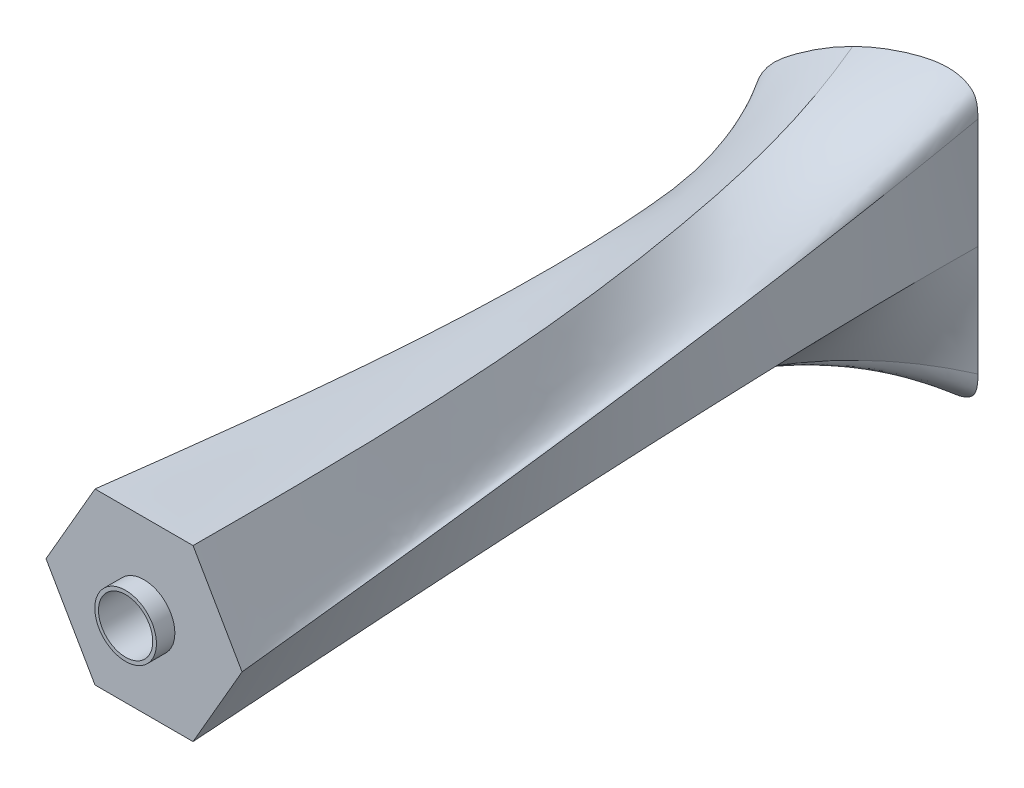
ISO-10303-21;
HEADER;
FILE_DESCRIPTION(('STEP AP214'),'2;1');
FILE_NAME('part.step','',(''),(''),'','','');
FILE_SCHEMA(('AUTOMOTIVE_DESIGN { 1 0 10303 214 1 1 1 1 }'));
ENDSEC;
DATA;
#1=APPLICATION_CONTEXT('core data for automotive mechanical design processes');
#2=APPLICATION_PROTOCOL_DEFINITION('international standard','automotive_design',2000,#1);
#3=PRODUCT_CONTEXT('',#1,'mechanical');
#4=PRODUCT('Part','Part','',(#3));
#5=PRODUCT_RELATED_PRODUCT_CATEGORY('part','',(#4));
#6=PRODUCT_DEFINITION_FORMATION('','',#4);
#7=PRODUCT_DEFINITION_CONTEXT('part definition',#1,'design');
#8=PRODUCT_DEFINITION('design','',#6,#7);
#9=PRODUCT_DEFINITION_SHAPE('','',#8);
#10=(LENGTH_UNIT() NAMED_UNIT(*) SI_UNIT(.MILLI.,.METRE.));
#11=(NAMED_UNIT(*) PLANE_ANGLE_UNIT() SI_UNIT($,.RADIAN.));
#12=(NAMED_UNIT(*) SI_UNIT($,.STERADIAN.) SOLID_ANGLE_UNIT());
#13=UNCERTAINTY_MEASURE_WITH_UNIT(LENGTH_MEASURE(1.E-05),#10,'distance_accuracy_value','');
#14=(GEOMETRIC_REPRESENTATION_CONTEXT(3) GLOBAL_UNCERTAINTY_ASSIGNED_CONTEXT((#13)) GLOBAL_UNIT_ASSIGNED_CONTEXT((#10,
#11,#12)) REPRESENTATION_CONTEXT('',''));
#15=CARTESIAN_POINT('',(0.,0.,0.));
#16=DIRECTION('',(0.,0.,1.));
#17=DIRECTION('',(1.,0.,0.));
#18=AXIS2_PLACEMENT_3D('',#15,#16,#17);
#19=CARTESIAN_POINT('',(0.,0.,400.));
#20=DIRECTION('',(0.,0.,1.));
#21=DIRECTION('',(1.,0.,0.));
#22=AXIS2_PLACEMENT_3D('',#19,#20,#21);
#23=PLANE('',#22);
#24=CARTESIAN_POINT('',(0.,0.,400.));
#25=DIRECTION('',(0.,0.,1.));
#26=DIRECTION('',(1.,0.,0.));
#27=AXIS2_PLACEMENT_3D('',#24,#25,#26);
#28=CIRCLE('',#27,16.7417135288678);
#29=CARTESIAN_POINT('',(16.7417135288678,0.,400.));
#30=VERTEX_POINT('',#29);
#31=EDGE_CURVE('E12',#30,#30,#28,.T.);
#32=ORIENTED_EDGE('',*,*,#31,.F.);
#33=EDGE_LOOP('',(#32));
#34=FACE_BOUND('',#33,.T.);
#35=DIRECTION('',(-0.5,-0.866025403784439,0.));
#36=VECTOR('',#35,1.);
#37=CARTESIAN_POINT('',(-26.6239504938894,46.1140349536149,400.));
#38=LINE('',#37,#36);
#39=CARTESIAN_POINT('',(-26.6239504938894,46.1140349536149,400.));
#40=VERTEX_POINT('',#39);
#41=CARTESIAN_POINT('',(-53.2479009877787,0.,400.));
#42=VERTEX_POINT('',#41);
#43=EDGE_CURVE('E300',#40,#42,#38,.T.);
#44=ORIENTED_EDGE('',*,*,#43,.T.);
#45=DIRECTION('',(0.5,-0.866025403784438,0.));
#46=VECTOR('',#45,1.);
#47=CARTESIAN_POINT('',(-53.2479009877787,0.,400.));
#48=LINE('',#47,#46);
#49=CARTESIAN_POINT('',(-26.6239504938894,-46.1140349536149,400.));
#50=VERTEX_POINT('',#49);
#51=EDGE_CURVE('E355',#42,#50,#48,.T.);
#52=ORIENTED_EDGE('',*,*,#51,.T.);
#53=DIRECTION('',(1.,0.,0.));
#54=VECTOR('',#53,1.);
#55=CARTESIAN_POINT('',(-26.6239504938894,-46.1140349536149,400.));
#56=LINE('',#55,#54);
#57=CARTESIAN_POINT('',(26.6239504938894,-46.1140349536149,400.));
#58=VERTEX_POINT('',#57);
#59=EDGE_CURVE('E441',#50,#58,#56,.T.);
#60=ORIENTED_EDGE('',*,*,#59,.T.);
#61=DIRECTION('',(0.5,0.866025403784439,0.));
#62=VECTOR('',#61,1.);
#63=CARTESIAN_POINT('',(26.6239504938894,-46.1140349536149,400.));
#64=LINE('',#63,#62);
#65=CARTESIAN_POINT('',(53.2479009877787,0.,400.));
#66=VERTEX_POINT('',#65);
#67=EDGE_CURVE('E409',#58,#66,#64,.T.);
#68=ORIENTED_EDGE('',*,*,#67,.T.);
#69=DIRECTION('',(-0.5,0.866025403784439,0.));
#70=VECTOR('',#69,1.);
#71=CARTESIAN_POINT('',(53.2479009877787,0.,400.));
#72=LINE('',#71,#70);
#73=CARTESIAN_POINT('',(26.6239504938894,46.1140349536149,400.));
#74=VERTEX_POINT('',#73);
#75=EDGE_CURVE('E404',#66,#74,#72,.T.);
#76=ORIENTED_EDGE('',*,*,#75,.T.);
#77=DIRECTION('',(-1.,0.,0.));
#78=VECTOR('',#77,1.);
#79=CARTESIAN_POINT('',(26.6239504938894,46.1140349536149,400.));
#80=LINE('',#79,#78);
#81=EDGE_CURVE('E224',#74,#40,#80,.T.);
#82=ORIENTED_EDGE('',*,*,#81,.T.);
#83=EDGE_LOOP('',(#44,#52,#60,#68,#76,#82));
#84=FACE_BOUND('',#83,.T.);
#85=ADVANCED_FACE('F214',(#34,#84),#23,.T.);
#86=CARTESIAN_POINT('',(-15.0373642119858,60.0919893012358,0.));
#87=DIRECTION('',(0.,0.,-1.));
#88=DIRECTION('',(-1.,0.,0.));
#89=AXIS2_PLACEMENT_3D('',#86,#87,#88);
#90=PLANE('',#89);
#91=CARTESIAN_POINT('',(0.,0.,0.));
#92=DIRECTION('',(0.,0.,-1.));
#93=DIRECTION('',(-1.,0.,0.));
#94=AXIS2_PLACEMENT_3D('',#91,#92,#93);
#95=CIRCLE('',#94,14.7417135288678);
#96=CARTESIAN_POINT('',(-14.7417135288678,0.,0.));
#97=VERTEX_POINT('',#96);
#98=EDGE_CURVE('E640',#97,#97,#95,.F.);
#99=ORIENTED_EDGE('',*,*,#98,.T.);
#100=EDGE_LOOP('',(#99));
#101=FACE_BOUND('',#100,.T.);
#102=CARTESIAN_POINT('',(52.9999999999999,60.,0.));
#103=CARTESIAN_POINT('',(52.9999999999999,69.1159610700958,0.));
#104=CARTESIAN_POINT('',(44.4020992876868,78.7091502966451,0.));
#105=CARTESIAN_POINT('',(3.59329165933707,71.3680812588061,0.));
#106=CARTESIAN_POINT('',(-41.0599767034841,47.5530420157573,0.));
#107=CARTESIAN_POINT('',(-69.0000000000001,22.1315700799517,0.));
#108=CARTESIAN_POINT('',(-69.,5.07899308115912,0.));
#109=B_SPLINE_CURVE_WITH_KNOTS('',3,(#102,#103,#104,#105,#106,#107,#108),.UNSPECIFIED.,.F.,.F.,
(4,1,1,1,4),(0.,0.0739990040143119,0.286658719787785,0.740794666502256,1.),.UNSPECIFIED.);
#110=CARTESIAN_POINT('',(52.9999999999999,60.0000000000001,0.));
#111=VERTEX_POINT('',#110);
#112=CARTESIAN_POINT('',(-15.0373642122471,60.0919893011055,0.));
#113=VERTEX_POINT('',#112);
#114=EDGE_CURVE('E286',#111,#113,#109,.T.);
#115=ORIENTED_EDGE('',*,*,#114,.F.);
#116=DIRECTION('',(0.,1.,0.));
#117=VECTOR('',#116,1.);
#118=CARTESIAN_POINT('',(53.0000000000001,-60.,0.));
#119=LINE('',#118,#117);
#120=CARTESIAN_POINT('',(53.,0.,0.));
#121=VERTEX_POINT('',#120);
#122=EDGE_CURVE('E468',#121,#111,#119,.T.);
#123=ORIENTED_EDGE('',*,*,#122,.F.);
#124=CARTESIAN_POINT('',(53.0000000000001,-60.,0.));
#125=VERTEX_POINT('',#124);
#126=EDGE_CURVE('E465',#125,#121,#119,.T.);
#127=ORIENTED_EDGE('',*,*,#126,.F.);
#128=CARTESIAN_POINT('',(-69.,-5.07899308115939,0.));
#129=CARTESIAN_POINT('',(-69.,-22.131570079952,0.));
#130=CARTESIAN_POINT('',(-41.059976703484,-47.5530420157575,0.));
#131=CARTESIAN_POINT('',(3.59329165933726,-71.3680812588063,0.));
#132=CARTESIAN_POINT('',(44.402099287687,-78.709150296645,0.));
#133=CARTESIAN_POINT('',(53.0000000000001,-69.1159610700957,0.));
#134=CARTESIAN_POINT('',(53.0000000000001,-60.,0.));
#135=B_SPLINE_CURVE_WITH_KNOTS('',3,(#128,#129,#130,#131,#132,#133,#134),.UNSPECIFIED.,.F.,.F.,
(4,1,1,1,4),(0.,0.259205333497744,0.713341280212215,0.926000995985688,1.),.UNSPECIFIED.);
#136=CARTESIAN_POINT('',(-69.,-5.07899308115939,0.));
#137=VERTEX_POINT('',#136);
#138=EDGE_CURVE('E279',#137,#125,#135,.T.);
#139=ORIENTED_EDGE('',*,*,#138,.F.);
#140=DIRECTION('',(0.,-1.,0.));
#141=VECTOR('',#140,1.);
#142=CARTESIAN_POINT('',(-69.,5.07899308115912,0.));
#143=LINE('',#142,#141);
#144=CARTESIAN_POINT('',(-69.,5.07899308115912,0.));
#145=VERTEX_POINT('',#144);
#146=EDGE_CURVE('E271',#145,#137,#143,.T.);
#147=ORIENTED_EDGE('',*,*,#146,.F.);
#148=EDGE_CURVE('E276',#113,#145,#109,.T.);
#149=ORIENTED_EDGE('',*,*,#148,.F.);
#150=EDGE_LOOP('',(#115,#123,#127,#139,#147,#149));
#151=FACE_BOUND('',#150,.T.);
#152=ADVANCED_FACE('F275',(#101,#151),#90,.T.);
#153=CARTESIAN_POINT('',(53.0000000000001,-60.,0.));
#154=CARTESIAN_POINT('',(24.6310418483275,-47.8812141708108,30.3470000079347));
#155=CARTESIAN_POINT('',(-30.6471797643207,-28.8561105763167,161.254535663122));
#156=CARTESIAN_POINT('',(-28.4515918142654,-38.6239041398874,297.013666674601));
#157=CARTESIAN_POINT('',(-26.6239504938894,-46.1140349536149,400.));
#158=CARTESIAN_POINT('',(53.0000000000001,-40.,0.));
#159=CARTESIAN_POINT('',(30.7384725890359,-35.0874248680189,30.9250320509449));
#160=CARTESIAN_POINT('',(-12.3510202419729,-29.7908385638429,160.319677642095));
#161=CARTESIAN_POINT('',(-10.511294187384,-39.1634481704289,297.591698717612));
#162=CARTESIAN_POINT('',(-8.87465016462978,-46.1140349536149,400.));
#163=CARTESIAN_POINT('',(53.,-20.,0.));
#164=CARTESIAN_POINT('',(36.8459033297443,-22.293635565227,31.5030640939551));
#165=CARTESIAN_POINT('',(5.94513928037495,-30.7255665513692,159.384819621069));
#166=CARTESIAN_POINT('',(7.42900343949746,-39.7029922009703,298.169730760622));
#167=CARTESIAN_POINT('',(8.8746501646298,-46.1140349536149,400.));
#168=CARTESIAN_POINT('',(53.,0.,0.));
#169=CARTESIAN_POINT('',(42.9533340704527,-9.49984626243509,32.0810961369654));
#170=CARTESIAN_POINT('',(24.2412988027228,-31.6602945388954,158.449961600043));
#171=CARTESIAN_POINT('',(25.3693010663789,-40.2425362315117,298.747762803632));
#172=CARTESIAN_POINT('',(26.6239504938894,-46.1140349536149,400.));
#173=B_SPLINE_SURFACE_WITH_KNOTS('',3,3,((#153,#154,#155,#156,#157),(#158,#159,#160,#161,#162),
(#163,#164,#165,#166,#167),(#168,#169,#170,#171,#172)),.UNSPECIFIED.,.F.,.F.,.F.,(4,4),(4,1,4),
(0.,1.),(0.,0.257174354760938,1.),.UNSPECIFIED.);
#174=CARTESIAN_POINT('',(53.,0.,0.));
#175=CARTESIAN_POINT('',(42.9533340704527,-9.49984626243509,32.0810961369654));
#176=CARTESIAN_POINT('',(24.2412988027228,-31.6602945388954,158.449961600043));
#177=CARTESIAN_POINT('',(25.3693010663789,-40.2425362315117,298.747762803632));
#178=CARTESIAN_POINT('',(26.6239504938894,-46.1140349536149,400.));
#179=B_SPLINE_CURVE_WITH_KNOTS('',3,(#174,#175,#176,#177,#178),.UNSPECIFIED.,.F.,.F.,(4,1,4),
(0.,0.257174354760938,1.),.UNSPECIFIED.);
#180=EDGE_CURVE('E464',#121,#58,#179,.T.);
#181=CARTESIAN_POINT('',(53.0000000000001,-60.,0.));
#182=CARTESIAN_POINT('',(24.6310418483275,-47.8812141708108,30.3470000079347));
#183=CARTESIAN_POINT('',(-30.6471797643207,-28.8561105763167,161.254535663122));
#184=CARTESIAN_POINT('',(-28.4515918142654,-38.6239041398874,297.013666674601));
#185=CARTESIAN_POINT('',(-26.6239504938894,-46.1140349536149,400.));
#186=B_SPLINE_CURVE_WITH_KNOTS('',3,(#181,#182,#183,#184,#185),.UNSPECIFIED.,.F.,.F.,(4,1,4),
(0.,0.257174354760938,1.),.UNSPECIFIED.);
#187=EDGE_CURVE('E463',#50,#125,#186,.F.);
#188=ORIENTED_EDGE('',*,*,#126,.T.);
#189=ORIENTED_EDGE('',*,*,#180,.T.);
#190=ORIENTED_EDGE('',*,*,#59,.F.);
#191=ORIENTED_EDGE('',*,*,#187,.T.);
#192=EDGE_LOOP('',(#188,#189,#190,#191));
#193=FACE_BOUND('',#192,.T.);
#194=ADVANCED_FACE('F462',(#193),#173,.T.);
#195=CARTESIAN_POINT('',(53.,0.,0.));
#196=CARTESIAN_POINT('',(42.9533340704527,-9.49984626243509,32.0810961369654));
#197=CARTESIAN_POINT('',(24.2412988027227,-31.6602945388954,158.449961600043));
#198=CARTESIAN_POINT('',(25.3693010663789,-40.2425362315117,298.747762803632));
#199=CARTESIAN_POINT('',(26.6239504938894,-46.1140349536149,400.));
#200=CARTESIAN_POINT('',(53.,20.,0.));
#201=CARTESIAN_POINT('',(42.2154452997272,6.47288569592673,31.8651390261619));
#202=CARTESIAN_POINT('',(24.4105280379211,-22.0615279952037,158.799231575079));
#203=CARTESIAN_POINT('',(30.54784573874,-27.3555742834577,298.531805692829));
#204=CARTESIAN_POINT('',(35.4986006585192,-30.7426899690766,400.));
#205=CARTESIAN_POINT('',(53.,40.,0.));
#206=CARTESIAN_POINT('',(41.4775565290017,22.4456176542885,31.6491819153585));
#207=CARTESIAN_POINT('',(24.5797572731195,-12.4627614515119,159.148501550115));
#208=CARTESIAN_POINT('',(35.7263904111011,-14.4686123354037,298.315848582025));
#209=CARTESIAN_POINT('',(44.373250823149,-15.3713449845383,400.));
#210=CARTESIAN_POINT('',(52.9999999999999,60.0000000000001,0.));
#211=CARTESIAN_POINT('',(40.7396677582763,38.4183496126504,31.433224804555));
#212=CARTESIAN_POINT('',(24.7489865083178,-2.86399490782015,159.497771525151));
#213=CARTESIAN_POINT('',(40.9049350834622,-1.58165038734968,298.099891471222));
#214=CARTESIAN_POINT('',(53.2479009877787,0.,400.));
#215=B_SPLINE_SURFACE_WITH_KNOTS('',3,3,((#195,#196,#197,#198,#199),(#200,#201,#202,#203,#204),
(#205,#206,#207,#208,#209),(#210,#211,#212,#213,#214)),.UNSPECIFIED.,.F.,.F.,.F.,(4,4),(4,1,4),
(0.,1.),(0.,0.257174354760938,1.),.UNSPECIFIED.);
#216=CARTESIAN_POINT('',(52.9999999999999,60.0000000000001,0.));
#217=CARTESIAN_POINT('',(40.7396677582763,38.4183496126504,31.433224804555));
#218=CARTESIAN_POINT('',(24.7489865083178,-2.86399490782015,159.497771525151));
#219=CARTESIAN_POINT('',(40.9049350834622,-1.58165038734968,298.099891471222));
#220=CARTESIAN_POINT('',(53.2479009877787,0.,400.));
#221=B_SPLINE_CURVE_WITH_KNOTS('',3,(#216,#217,#218,#219,#220),.UNSPECIFIED.,.F.,.F.,(4,1,4),
(0.,0.257174354760938,1.),.UNSPECIFIED.);
#222=EDGE_CURVE('E305',#111,#66,#221,.T.);
#223=ORIENTED_EDGE('',*,*,#122,.T.);
#224=ORIENTED_EDGE('',*,*,#222,.T.);
#225=ORIENTED_EDGE('',*,*,#67,.F.);
#226=ORIENTED_EDGE('',*,*,#180,.F.);
#227=EDGE_LOOP('',(#223,#224,#225,#226));
#228=FACE_BOUND('',#227,.T.);
#229=ADVANCED_FACE('F373',(#228),#215,.T.);
#230=CARTESIAN_POINT('',(-69.,-5.07899308115939,0.));
#231=CARTESIAN_POINT('',(-47.393481818453,-15.4453230909937,32.3352916155948));
#232=CARTESIAN_POINT('',(-15.8341530514473,-27.9524668294481,158.038848263025));
#233=CARTESIAN_POINT('',(-36.8920824769722,-12.0593277035542,299.001958282261));
#234=CARTESIAN_POINT('',(-53.2479009877787,0.,400.));
#235=CARTESIAN_POINT('',(-69.,-9.19073741929746,0.));
#236=CARTESIAN_POINT('',(-47.1569608251326,-17.50670876261,32.3400691883035));
#237=CARTESIAN_POINT('',(-14.4114703968578,-26.0878832417253,158.031121438497));
#238=CARTESIAN_POINT('',(-36.1722074545428,-11.9326071892124,299.00673585497));
#239=CARTESIAN_POINT('',(-52.6932353524894,-0.960709061533651,400.));
#240=CARTESIAN_POINT('',(-67.8193825685981,-16.5055481878557,0.));
#241=CARTESIAN_POINT('',(-45.50330140709,-20.7208021981246,32.349624333721));
#242=CARTESIAN_POINT('',(-13.2711602166725,-23.6710344227163,158.015667789441));
#243=CARTESIAN_POINT('',(-34.7324574096839,-11.6791661605289,299.016291000388));
#244=CARTESIAN_POINT('',(-51.5839040819107,-2.88212718460094,400.));
#245=CARTESIAN_POINT('',(-63.2894695065897,-25.3301094077434,0.));
#246=CARTESIAN_POINT('',(-42.430432947814,-25.0750275477511,32.3785289760455));
#247=CARTESIAN_POINT('',(-12.2552083279209,-20.5952756422473,157.968919971481));
#248=CARTESIAN_POINT('',(-33.5029276578076,-12.019991981713,299.045195642712));
#249=CARTESIAN_POINT('',(-49.9199071760426,-5.76425436920188,400.));
#250=CARTESIAN_POINT('',(-57.8664570229374,-31.3765581710786,0.));
#251=CARTESIAN_POINT('',(-39.0579207086074,-28.0607121770605,32.4216046468823));
#252=CARTESIAN_POINT('',(-12.5187831168298,-18.911301908346,157.899253182451));
#253=CARTESIAN_POINT('',(-32.8375729776284,-12.5884062078644,299.088271313549));
#254=CARTESIAN_POINT('',(-48.5332430878192,-8.16602702303599,400.));
#255=CARTESIAN_POINT('',(-52.931395452378,-35.7194662795903,0.));
#256=CARTESIAN_POINT('',(-36.1393103485606,-30.2641640017131,32.4495466921982));
#257=CARTESIAN_POINT('',(-13.0201878677334,-17.8084594356236,157.854062183953));
#258=CARTESIAN_POINT('',(-32.4673165326842,-13.1758897210257,299.116213358865));
#259=CARTESIAN_POINT('',(-47.4239118172404,-10.0874451461033,400.));
#260=CARTESIAN_POINT('',(-49.0269984838212,-38.7995637827274,0.));
#261=CARTESIAN_POINT('',(-33.86276595671,-31.8407633455555,32.4630192660508));
#262=CARTESIAN_POINT('',(-13.5141066141855,-17.083519999444,157.832272831819));
#263=CARTESIAN_POINT('',(-32.2394664589599,-13.6601297002574,299.129685932718));
#264=CARTESIAN_POINT('',(-46.5919133643064,-11.5285087384037,400.));
#265=CARTESIAN_POINT('',(-45.0269314150286,-41.7831985102968,0.));
#266=CARTESIAN_POINT('',(-31.5476228862595,-33.3787764345176,32.464380260895));
#267=CARTESIAN_POINT('',(-14.0595048608204,-16.4099268224096,157.830071678852));
#268=CARTESIAN_POINT('',(-32.0362542819011,-14.1696736361481,299.131046927561));
#269=CARTESIAN_POINT('',(-45.7599149113723,-12.9695723307042,400.));
#270=CARTESIAN_POINT('',(-40.9593774061973,-44.6868534782732,0.));
#271=CARTESIAN_POINT('',(-29.2040750326816,-34.8843506410387,32.4525629164262));
#272=CARTESIAN_POINT('',(-14.6430290524314,-15.7795480756383,157.849184009038));
#273=CARTESIAN_POINT('',(-31.8497742265991,-14.7002106011731,299.119229583093));
#274=CARTESIAN_POINT('',(-44.9279164584383,-14.4106359230047,400.));
#275=CARTESIAN_POINT('',(-36.8160516195801,-47.5007710828428,0.));
#276=CARTESIAN_POINT('',(-26.8286820397434,-36.3537998743776,32.4277840874437));
#277=CARTESIAN_POINT('',(-15.2693191665575,-15.1972438442931,157.889259100559));
#278=CARTESIAN_POINT('',(-31.6819245959196,-15.2544175200732,299.09445075411));
#279=CARTESIAN_POINT('',(-44.0959180055043,-15.8516995153051,400.));
#280=CARTESIAN_POINT('',(-31.198627596288,-51.1300424861392,0.));
#281=CARTESIAN_POINT('',(-23.6218039784361,-38.2637483477609,32.3772460297177));
#282=CARTESIAN_POINT('',(-16.1578258583447,-14.486446981368,157.970994895665));
#283=CARTESIAN_POINT('',(-31.4804443872336,-16.0257992058588,299.043912696385));
#284=CARTESIAN_POINT('',(-42.9865867349255,-17.7731176383724,400.));
#285=CARTESIAN_POINT('',(-23.9968152786962,-55.427226276019,0.));
#286=CARTESIAN_POINT('',(-19.5356056610384,-40.5550755338951,32.2811749738894));
#287=CARTESIAN_POINT('',(-17.3731882420795,-13.7257605183685,158.126371744086));
#288=CARTESIAN_POINT('',(-31.2710102312231,-17.0535179482678,298.947841640556));
#289=CARTESIAN_POINT('',(-41.5999226467021,-20.1748902922065,400.));
#290=CARTESIAN_POINT('',(-16.5685989580877,-59.3763428880387,0.));
#291=CARTESIAN_POINT('',(-15.3490999498301,-42.7067293575584,32.1410886603588));
#292=CARTESIAN_POINT('',(-18.7246508110828,-13.1508009793675,158.352934986425));
#293=CARTESIAN_POINT('',(-31.1122063925092,-18.1736094288741,298.807755327025));
#294=CARTESIAN_POINT('',(-40.2132585584787,-22.5766629460406,400.));
#295=CARTESIAN_POINT('',(-10.4899935307653,-62.3127635204361,0.));
#296=CARTESIAN_POINT('',(-11.9380048977213,-44.3385209869329,32.0023849812586));
#297=CARTESIAN_POINT('',(-19.8902185034221,-12.8099133134083,158.577262077839));
#298=CARTESIAN_POINT('',(-31.0139607278217,-19.1287326798983,298.669051647926));
#299=CARTESIAN_POINT('',(-39.1039272879,-24.4980810691079,400.));
#300=CARTESIAN_POINT('',(-5.86624267025815,-64.3986278326721,0.));
#301=CARTESIAN_POINT('',(-9.34965398343143,-45.5154894062781,31.8850668279749));
#302=CARTESIAN_POINT('',(-20.8054837448217,-12.6166206476253,158.767002106849));
#303=CARTESIAN_POINT('',(-30.9534447620441,-19.8758339604166,298.551733494642));
#304=CARTESIAN_POINT('',(-38.271928834966,-25.9391446614084,400.));
#305=CARTESIAN_POINT('',(-1.17674131165859,-66.3651131698102,0.));
#306=CARTESIAN_POINT('',(-6.73043032229556,-46.6443362483411,31.7543344345641));
#307=CARTESIAN_POINT('',(-21.7630919980424,-12.4873788079004,158.978437144172));
#308=CARTESIAN_POINT('',(-30.9058897019709,-20.6543996371655,298.42100110123));
#309=CARTESIAN_POINT('',(-37.4399303820319,-27.3802082537088,400.));
#310=CARTESIAN_POINT('',(3.57624193034993,-68.2073027294643,0.));
#311=CARTESIAN_POINT('',(-4.0808288424389,-47.7229432815857,31.6101907708229));
#312=CARTESIAN_POINT('',(-22.7625046135846,-12.4250462159358,159.211562386722));
#313=CARTESIAN_POINT('',(-30.8702780822245,-21.4655893594006,298.27685743749));
#314=CARTESIAN_POINT('',(-36.6079319290979,-28.8212718460093,400.));
#315=CARTESIAN_POINT('',(8.39284805649683,-69.9225159811169,0.));
#316=CARTESIAN_POINT('',(-1.40030898533931,-48.7501131801964,31.4524652962592));
#317=CARTESIAN_POINT('',(-23.804579571861,-12.4312499784503,159.466653651643));
#318=CARTESIAN_POINT('',(-30.8461633404052,-22.3099928182935,298.119131962925));
#319=CARTESIAN_POINT('',(-35.7759334761638,-30.2623354383098,400.));
#320=CARTESIAN_POINT('',(13.2707331781147,-71.5046710969188,0.));
#321=CARTESIAN_POINT('',(1.31062669357092,-49.7231756144395,31.2811919153481));
#322=CARTESIAN_POINT('',(-24.8887745771472,-12.5096069858862,159.743656104827));
#323=CARTESIAN_POINT('',(-30.8324854406701,-23.1889942369082,297.947858582015));
#324=CARTESIAN_POINT('',(-34.9439350232298,-31.7033990306102,400.));
#325=CARTESIAN_POINT('',(18.2114530384099,-72.9540192169259,0.));
#326=CARTESIAN_POINT('',(4.05316531068852,-50.6421175558863,31.0959641862339));
#327=CARTESIAN_POINT('',(-26.0168300283749,-12.6601672917927,160.043227089469));
#328=CARTESIAN_POINT('',(-30.8290944284445,-24.102413159877,297.7626308529));
#329=CARTESIAN_POINT('',(-34.1119365702958,-33.1444626229107,400.));
#330=CARTESIAN_POINT('',(22.3731334096532,-74.0372466415818,0.));
#331=CARTESIAN_POINT('',(6.36199672494863,-51.3567761555153,30.9305718773702));
#332=CARTESIAN_POINT('',(-26.9895676210744,-12.8539464766438,160.310718015668));
#333=CARTESIAN_POINT('',(-30.8324952322797,-24.8955110276703,297.597238544037));
#334=CARTESIAN_POINT('',(-33.4186045261841,-34.3453489498278,400.));
#335=CARTESIAN_POINT('',(25.6802374467093,-74.7669461163012,0.));
#336=CARTESIAN_POINT('',(8.20200825238955,-51.8710899922119,30.7969571169452));
#337=CARTESIAN_POINT('',(-27.7589164255861,-13.0860278791678,160.526814739061));
#338=CARTESIAN_POINT('',(-30.827442639341,-25.5638312556015,297.463623783612));
#339=CARTESIAN_POINT('',(-32.8639388908947,-35.3060580113614,400.));
#340=CARTESIAN_POINT('',(28.1417776727613,-75.2348738955184,0.));
#341=CARTESIAN_POINT('',(9.57510072786152,-52.2233788007688,30.69715355102));
#342=CARTESIAN_POINT('',(-28.326910606459,-13.3050255476033,160.688228219958));
#343=CARTESIAN_POINT('',(-30.8180441636185,-26.084522742036,297.363820217686));
#344=CARTESIAN_POINT('',(-32.4479396644277,-36.0265898075116,400.));
#345=CARTESIAN_POINT('',(30.5718863767311,-75.6076154602207,0.));
#346=CARTESIAN_POINT('',(10.935703007769,-52.5353562937534,30.5993197144683));
#347=CARTESIAN_POINT('',(-28.8783315593033,-13.578234344891,160.846456034374));
#348=CARTESIAN_POINT('',(-30.8001815352815,-26.6283603896118,297.265986381135));
#349=CARTESIAN_POINT('',(-32.0319404379607,-36.7471216036619,400.));
#350=CARTESIAN_POINT('',(32.9611635091277,-75.8725715548433,0.));
#351=CARTESIAN_POINT('',(12.2795984247989,-52.8015347834415,30.5047602163615));
#352=CARTESIAN_POINT('',(-29.4074444183297,-13.9130755732478,160.999388222716));
#353=CARTESIAN_POINT('',(-30.7718047225703,-27.1982560125585,297.171426883028));
#354=CARTESIAN_POINT('',(-31.6159412114936,-37.4676533998121,400.));
#355=CARTESIAN_POINT('',(35.2984853193747,-76.0154774967754,0.));
#356=CARTESIAN_POINT('',(13.6017820475539,-53.0157069161382,30.4149713879457));
#357=CARTESIAN_POINT('',(-29.9074383708399,-14.3179422613434,161.144604750862));
#358=CARTESIAN_POINT('',(-30.7305028209705,-27.7975120521475,297.081638054612));
#359=CARTESIAN_POINT('',(-31.1999419850266,-38.1881851959623,400.));
#360=CARTESIAN_POINT('',(37.5736904441233,-76.0228226569472,0.));
#361=CARTESIAN_POINT('',(14.8976318537747,-53.1719935915715,30.3313657616016));
#362=CARTESIAN_POINT('',(-30.372010822799,-14.8007835756234,161.279821113581));
#363=CARTESIAN_POINT('',(-30.6741236186979,-28.429256469672,296.998032428268));
#364=CARTESIAN_POINT('',(-30.7839427585596,-38.9087169921126,400.));
#365=CARTESIAN_POINT('',(39.7759487624774,-75.8808327809258,0.));
#366=CARTESIAN_POINT('',(16.1622099169986,-53.2644121395267,30.2553832709568));
#367=CARTESIAN_POINT('',(-30.7944254483536,-15.3696857440395,161.402708489282));
#368=CARTESIAN_POINT('',(-30.6003849310548,-29.0966895225727,296.922049937623));
#369=CARTESIAN_POINT('',(-30.3679435320926,-39.6292487882628,400.));
#370=CARTESIAN_POINT('',(41.8950201795379,-75.5756479642799,0.));
#371=CARTESIAN_POINT('',(17.3908154403757,-53.2869694028927,30.1883795988492));
#372=CARTESIAN_POINT('',(-31.1682613179775,-16.0327421456452,161.511074316169));
#373=CARTESIAN_POINT('',(-30.5071609390218,-29.8030576490393,296.855046265516));
#374=CARTESIAN_POINT('',(-29.9519443056255,-40.349780584413,400.));
#375=CARTESIAN_POINT('',(43.9201217772736,-75.0938785891157,0.));
#376=CARTESIAN_POINT('',(18.5785115340639,-53.2338986472327,30.1316390135726));
#377=CARTESIAN_POINT('',(-31.4867784033723,-16.7977339569014,161.602841532027));
#378=CARTESIAN_POINT('',(-30.3921994947296,-30.551521799145,296.798305680239));
#379=CARTESIAN_POINT('',(-29.5359450791585,-41.0703123805633,400.));
#380=CARTESIAN_POINT('',(45.5206635909464,-74.5331963955322,0.));
#381=CARTESIAN_POINT('',(19.5301643509228,-53.121508989626,30.0939022107014));
#382=CARTESIAN_POINT('',(-31.7006444315991,-17.527097007139,161.663873707109));
#383=CARTESIAN_POINT('',(-30.2764646957688,-31.2132132511268,296.760568877368));
#384=CARTESIAN_POINT('',(-29.1892790571027,-41.6707555440218,400.));
#385=CARTESIAN_POINT('',(46.7438265314824,-73.9832756420719,0.));
#386=CARTESIAN_POINT('',(20.2663312045458,-52.9882103237044,30.0698852421711));
#387=CARTESIAN_POINT('',(-31.8376627603627,-18.1690574013871,161.702716632761));
#388=CARTESIAN_POINT('',(-30.1708495781273,-31.766769794812,296.736551908838));
#389=CARTESIAN_POINT('',(-28.911946239458,-42.1511100747886,400.));
#390=CARTESIAN_POINT('',(47.6309127041933,-73.5163073177469,0.));
#391=CARTESIAN_POINT('',(20.8051349616891,-52.8649590044343,30.0551710233079));
#392=CARTESIAN_POINT('',(-31.9223756901538,-18.681884983754,161.726514111973));
#393=CARTESIAN_POINT('',(-30.0847753222323,-32.1949926264545,296.721837689975));
#394=CARTESIAN_POINT('',(-28.7039466262245,-42.5113759728637,400.));
#395=CARTESIAN_POINT('',(48.4871825462074,-72.9994347112464,0.));
#396=CARTESIAN_POINT('',(21.3303610323239,-52.7202479561613,30.0435442989601));
#397=CARTESIAN_POINT('',(-31.9886898053081,-19.2236478849203,161.745318149995));
#398=CARTESIAN_POINT('',(-29.991710150524,-32.6350981388907,296.710210965627));
#399=CARTESIAN_POINT('',(-28.495947012991,-42.8716418709389,400.));
#400=CARTESIAN_POINT('',(49.5805748485001,-72.2124249429084,0.));
#401=CARTESIAN_POINT('',(22.0094479428562,-52.4861976607952,30.0337844734861));
#402=CARTESIAN_POINT('',(-32.048351192593,-20.001244608005,161.761102830513));
#403=CARTESIAN_POINT('',(-29.8567587445731,-33.2456708429975,296.700451140153));
#404=CARTESIAN_POINT('',(-28.2186141953463,-43.3519964017057,400.));
#405=CARTESIAN_POINT('',(50.8199586481237,-70.9404127600483,0.));
#406=CARTESIAN_POINT('',(22.7999101529385,-52.0663708432518,30.0383954263723));
#407=CARTESIAN_POINT('',(-32.0433273260026,-21.1453607999399,161.753645482184));
#408=CARTESIAN_POINT('',(-29.6607110873071,-34.0763317782867,296.705062093039));
#409=CARTESIAN_POINT('',(-27.8719481732904,-43.9524395651642,400.));
#410=CARTESIAN_POINT('',(52.0099353645367,-68.6207493869061,0.));
#411=CARTESIAN_POINT('',(23.6212859806009,-51.2459458633454,30.0872029528361));
#412=CARTESIAN_POINT('',(-31.8652434315717,-22.9408685152371,161.67470849564));
#413=CARTESIAN_POINT('',(-29.3583433384501,-35.273666214507,296.753869619503));
#414=CARTESIAN_POINT('',(-27.4559489468234,-44.6729713613144,400.));
#415=CARTESIAN_POINT('',(52.8020193437475,-65.1826930034343,0.));
#416=CARTESIAN_POINT('',(24.2400965992515,-49.8780414775446,30.1857611954005));
#417=CARTESIAN_POINT('',(-31.4079315047811,-25.4853861146214,161.51530909086));
#418=CARTESIAN_POINT('',(-28.9790403049378,-36.7116823757165,296.852427862067));
#419=CARTESIAN_POINT('',(-27.0399497203564,-45.3935031574647,400.));
#420=CARTESIAN_POINT('',(53.0000000000001,-61.9248487681361,0.));
#421=CARTESIAN_POINT('',(24.5667203173864,-48.7441077067134,30.2932537370899));
#422=CARTESIAN_POINT('',(-30.996071981301,-27.4476163343266,161.341460139034));
#423=CARTESIAN_POINT('',(-28.6274079778229,-37.9864968851638,296.959920403757));
#424=CARTESIAN_POINT('',(-26.7626169027117,-45.8738576882315,400.));
#425=CARTESIAN_POINT('',(53.0000000000001,-60.,0.));
#426=CARTESIAN_POINT('',(24.6310418483275,-47.8812141708108,30.3470000079347));
#427=CARTESIAN_POINT('',(-30.6471797643207,-28.8561105763167,161.254535663122));
#428=CARTESIAN_POINT('',(-28.4515918142654,-38.6239041398874,297.013666674601));
#429=CARTESIAN_POINT('',(-26.6239504938894,-46.1140349536149,400.));
#430=B_SPLINE_SURFACE_WITH_KNOTS('',3,3,((#230,#231,#232,#233,#234),(#235,#236,#237,#238,#239),
(#240,#241,#242,#243,#244),(#245,#246,#247,#248,#249),(#250,#251,#252,#253,#254),(#255,#256,
#257,#258,#259),(#260,#261,#262,#263,#264),(#265,#266,#267,#268,#269),(#270,#271,#272,#273,
#274),(#275,#276,#277,#278,#279),(#280,#281,#282,#283,#284),(#285,#286,#287,#288,#289),(#290,
#291,#292,#293,#294),(#295,#296,#297,#298,#299),(#300,#301,#302,#303,#304),(#305,#306,#307,#308,
#309),(#310,#311,#312,#313,#314),(#315,#316,#317,#318,#319),(#320,#321,#322,#323,#324),(#325,
#326,#327,#328,#329),(#330,#331,#332,#333,#334),(#335,#336,#337,#338,#339),(#340,#341,#342,#343,
#344),(#345,#346,#347,#348,#349),(#350,#351,#352,#353,#354),(#355,#356,#357,#358,#359),(#360,
#361,#362,#363,#364),(#365,#366,#367,#368,#369),(#370,#371,#372,#373,#374),(#375,#376,#377,#378,
#379),(#380,#381,#382,#383,#384),(#385,#386,#387,#388,#389),(#390,#391,#392,#393,#394),(#395,
#396,#397,#398,#399),(#400,#401,#402,#403,#404),(#405,#406,#407,#408,#409),(#410,#411,#412,#413,
#414),(#415,#416,#417,#418,#419),(#420,#421,#422,#423,#424),(#425,#426,#427,#428,#429)),
.UNSPECIFIED.,.F.,.F.,.F.,(4,1,1,1,1,1,1,1,1,1,1,1,1,1,1,1,1,1,1,1,1,1,1,1,1,1,1,1,1,1,1,1,1,1,
1,1,1,4),(4,1,4),(0.,0.0625,0.125,0.1875,0.21875,0.25,0.28125,0.3125,0.34375,0.375,0.4375,0.5,
0.53125,0.5625,0.59375,0.625,0.65625,0.6875,0.71875,0.75,0.765625,0.78125,0.796875,0.8125,
0.828125,0.84375,0.859375,0.875,0.890625,0.90625,0.9140625,0.921875,0.9296875,0.9375,0.953125,
0.96875,0.984375,1.),(0.,0.257174354760938,1.),.UNSPECIFIED.);
#431=CARTESIAN_POINT('',(-69.,-5.07899308115939,0.));
#432=CARTESIAN_POINT('',(-47.393481818453,-15.4453230909937,32.3352916155948));
#433=CARTESIAN_POINT('',(-15.8341530514472,-27.9524668294481,158.038848263025));
#434=CARTESIAN_POINT('',(-36.8920824769722,-12.0593277035541,299.001958282261));
#435=CARTESIAN_POINT('',(-53.2479009877787,0.,400.));
#436=B_SPLINE_CURVE_WITH_KNOTS('',3,(#431,#432,#433,#434,#435),.UNSPECIFIED.,.F.,.F.,(4,1,4),
(0.,0.257174354760938,1.),.UNSPECIFIED.);
#437=EDGE_CURVE('E302',#137,#42,#436,.T.);
#438=ORIENTED_EDGE('',*,*,#138,.T.);
#439=ORIENTED_EDGE('',*,*,#187,.F.);
#440=ORIENTED_EDGE('',*,*,#51,.F.);
#441=ORIENTED_EDGE('',*,*,#437,.F.);
#442=EDGE_LOOP('',(#438,#439,#440,#441));
#443=FACE_BOUND('',#442,.T.);
#444=ADVANCED_FACE('F361',(#443),#430,.T.);
#445=CARTESIAN_POINT('',(52.9999999999999,60.,0.));
#446=CARTESIAN_POINT('',(40.7396677582763,38.4183496126504,31.433224804555));
#447=CARTESIAN_POINT('',(24.7489865083179,-2.86399490782011,159.497771525151));
#448=CARTESIAN_POINT('',(40.9049350834622,-1.58165038734966,298.099891471222));
#449=CARTESIAN_POINT('',(53.2479009877787,0.,400.));
#450=CARTESIAN_POINT('',(52.9999999999999,61.9248487681431,0.));
#451=CARTESIAN_POINT('',(40.5559206731146,39.4349778103217,31.3420026035228));
#452=CARTESIAN_POINT('',(24.1370246933812,-3.78636805823964,159.645306263687));
#453=CARTESIAN_POINT('',(40.5172493500073,-1.58496866010286,298.00866927019));
#454=CARTESIAN_POINT('',(52.9705681701341,0.480354530766829,400.));
#455=CARTESIAN_POINT('',(52.8020220132799,65.1826908152074,0.));
#456=CARTESIAN_POINT('',(39.9904485160713,40.8763787164428,31.1595582014582));
#457=CARTESIAN_POINT('',(23.1990221186325,-4.7763529345228,159.940375740758));
#458=CARTESIAN_POINT('',(39.7418778830975,-1.59160520560925,297.826224868125));
#459=CARTESIAN_POINT('',(52.4159025348447,1.44106359230047,400.));
#460=CARTESIAN_POINT('',(52.0099304981171,68.6207533761438,0.));
#461=CARTESIAN_POINT('',(39.0280340761105,42.6961652365766,30.9938321862354));
#462=CARTESIAN_POINT('',(21.9287700766397,-5.84743029497743,160.208406374176));
#463=CARTESIAN_POINT('',(38.7416433858273,-1.13667988245887,297.660498852902));
#464=CARTESIAN_POINT('',(51.5839040819107,2.88212718460094,400.));
#465=CARTESIAN_POINT('',(50.8199681331938,70.9404049841032,0.));
#466=CARTESIAN_POINT('',(37.8736877179207,43.961877719066,30.8967291767492));
#467=CARTESIAN_POINT('',(20.9205512798979,-6.15883429375005,160.365452213384));
#468=CARTESIAN_POINT('',(37.8289626803755,-0.447655346926818,297.563395843416));
#469=CARTESIAN_POINT('',(50.7519056289766,4.32319077690141,400.));
#470=CARTESIAN_POINT('',(49.5805585094935,72.2124383425219,0.));
#471=CARTESIAN_POINT('',(36.8133500937192,44.7485561554485,30.8639858002329));
#472=CARTESIAN_POINT('',(20.2114523454492,-6.05936664907075,160.418408461298));
#473=CARTESIAN_POINT('',(37.1319461535227,0.289407538425454,297.530652466899));
#474=CARTESIAN_POINT('',(50.0585735848649,5.52407710381847,400.));
#475=CARTESIAN_POINT('',(48.487181218069,72.9994356500067,0.));
#476=CARTESIAN_POINT('',(35.9211448154135,45.274795668825,30.8543331504262));
#477=CARTESIAN_POINT('',(19.7033584941776,-5.84001000575705,160.434019805349));
#478=CARTESIAN_POINT('',(36.598977826164,0.931741422157645,297.520999817093));
#479=CARTESIAN_POINT('',(49.5039079495755,6.48478616535211,400.));
#480=CARTESIAN_POINT('',(47.630915221675,73.5163055900239,0.));
#481=CARTESIAN_POINT('',(35.2369545744667,45.6382672782272,30.8525078320906));
#482=CARTESIAN_POINT('',(19.3424408149785,-5.63344034546425,160.43697191416));
#483=CARTESIAN_POINT('',(36.2082795118343,1.43093004444347,297.519174498757));
#484=CARTESIAN_POINT('',(49.0879087231085,7.20531796150235,400.));
#485=CARTESIAN_POINT('',(46.7438261299702,73.98327614344,0.));
#486=CARTESIAN_POINT('',(34.5398039067435,45.9800624024279,30.8543827292513));
#487=CARTESIAN_POINT('',(18.9989228683881,-5.39758423910283,160.433939620932));
#488=CARTESIAN_POINT('',(35.8251938824638,1.94178132787788,297.521049395918));
#489=CARTESIAN_POINT('',(48.6719094966415,7.92584975765258,400.));
#490=CARTESIAN_POINT('',(45.5206415896638,74.5332053476588,0.));
#491=CARTESIAN_POINT('',(33.5933739204022,46.4044666636375,30.8621843715934));
#492=CARTESIAN_POINT('',(18.5635639281331,-5.04083629771701,160.421321933022));
#493=CARTESIAN_POINT('',(35.3244414868772,2.64003380715672,297.52885103826));
#494=CARTESIAN_POINT('',(48.1172438613521,8.88655881918622,400.));
#495=CARTESIAN_POINT('',(43.9201345002555,75.0938734204436,0.));
#496=CARTESIAN_POINT('',(32.3804297576559,46.8803172773762,30.8810596537703));
#497=CARTESIAN_POINT('',(18.0594787632052,-4.52113582739655,160.390794717177));
#498=CARTESIAN_POINT('',(34.7162815111374,3.54269905209938,297.547726320437));
#499=CARTESIAN_POINT('',(47.4239118172404,10.0874451461033,400.));
#500=CARTESIAN_POINT('',(41.895013660841,75.575650588335,0.));
#501=CARTESIAN_POINT('',(30.881343338113,47.3691973028684,30.9169141868106));
#502=CARTESIAN_POINT('',(17.5129551436496,-3.78669240199389,160.332806759229));
#503=CARTESIAN_POINT('',(34.0126097511363,4.67110256896987,297.583580853477));
#504=CARTESIAN_POINT('',(46.5919133643064,11.5285087384037,400.));
#505=CARTESIAN_POINT('',(39.7759523857425,75.8808313746123,0.));
#506=CARTESIAN_POINT('',(29.3432551204014,47.7823904584992,30.9642868872262));
#507=CARTESIAN_POINT('',(17.0186684644121,-2.95021975122305,160.256190333727));
#508=CARTESIAN_POINT('',(33.3325634858111,5.84155114072085,297.630953553893));
#509=CARTESIAN_POINT('',(45.7599149113724,12.9695723307042,400.));
#510=CARTESIAN_POINT('',(37.5736881662671,76.0228234355013,0.));
#511=CARTESIAN_POINT('',(27.7707803525035,48.1259381831451,31.0215021209513));
#512=CARTESIAN_POINT('',(16.5703936499416,-2.01994125256869,160.163655463351));
#513=CARTESIAN_POINT('',(32.6735992099458,7.05114649611717,297.688168787618));
#514=CARTESIAN_POINT('',(44.9279164584383,14.4106359230047,400.));
#515=CARTESIAN_POINT('',(35.2984871850422,76.0154770465285,0.));
#516=CARTESIAN_POINT('',(26.1683193673199,48.4060689004648,31.0868345172751));
#517=CARTESIAN_POINT('',(16.162198725226,-1.0043318956763,160.057992610444));
#518=CARTESIAN_POINT('',(32.0332732486588,8.29688388294326,297.753501183942));
#519=CARTESIAN_POINT('',(44.0959180055043,15.8516995153051,400.));
#520=CARTESIAN_POINT('',(32.9611612991629,75.8725718304852,0.));
#521=CARTESIAN_POINT('',(24.5404796563192,48.6289664237055,31.158569251899));
#522=CARTESIAN_POINT('',(15.7878796730445,0.0881974001391536,159.94197518051));
#523=CARTESIAN_POINT('',(31.4089851584722,9.57576060730644,297.825235918566));
#524=CARTESIAN_POINT('',(43.2639195525702,17.2927631076056,400.));
#525=CARTESIAN_POINT('',(30.5718898115587,75.6076152746791,0.));
#526=CARTESIAN_POINT('',(22.8915790809956,48.8006698508316,31.2350505541641));
#527=CARTESIAN_POINT('',(15.4416278926617,1.24943833933718,159.818281070909));
#528=CARTESIAN_POINT('',(30.798266605824,10.8848108022728,297.901717220831));
#529=CARTESIAN_POINT('',(42.4319210996362,18.7338266999061,400.));
#530=CARTESIAN_POINT('',(28.1417717285471,75.2348741852234,0.));
#531=CARTESIAN_POINT('',(21.226291255646,48.9275040764176,31.3146427597757));
#532=CARTESIAN_POINT('',(15.1171655580095,2.47080803945665,159.689555660741));
#533=CARTESIAN_POINT('',(30.1983918700944,12.2208481437261,297.981309426442));
#534=CARTESIAN_POINT('',(41.5999226467021,20.1748902922065,400.));
#535=CARTESIAN_POINT('',(25.6802352233189,74.7669432146684,0.));
#536=CARTESIAN_POINT('',(19.5485667827762,49.0150360120184,31.395898935399));
#537=CARTESIAN_POINT('',(14.8091913617334,3.74475653223779,159.558139092303));
#538=CARTESIAN_POINT('',(29.6070260875856,13.5810431400082,298.062565602066));
#539=CARTESIAN_POINT('',(40.7679241937681,21.615953884507,400.));
#540=CARTESIAN_POINT('',(22.3732786561663,74.037283744797,0.));
#541=CARTESIAN_POINT('',(17.3020825958889,49.0885522817113,31.5044529217555));
#542=CARTESIAN_POINT('',(14.4110785602779,5.50100694466559,159.382573453534));
#543=CARTESIAN_POINT('',(28.825625487444,15.4219443785846,298.171119588422));
#544=CARTESIAN_POINT('',(39.6585929231894,23.5373720075743,400.));
#545=CARTESIAN_POINT('',(18.2113643783372,72.9539951667577,0.));
#546=CARTESIAN_POINT('',(14.4837734764508,49.1112729087246,31.6376649884054));
#547=CARTESIAN_POINT('',(13.9266839829405,7.78843814248692,159.16712801152));
#548=CARTESIAN_POINT('',(27.8574827364625,17.7680398694759,298.304331655072));
#549=CARTESIAN_POINT('',(38.271928834966,25.9391446614084,400.));
#550=CARTESIAN_POINT('',(13.2707873343114,71.5046867830004,0.));
#551=CARTESIAN_POINT('',(11.1261432472256,49.0809860734896,31.7846411040465));
#552=CARTESIAN_POINT('',(13.3122430685996,10.6091981655753,158.929421811201));
#553=CARTESIAN_POINT('',(26.6842410229171,20.6253738117297,298.451307770712));
#554=CARTESIAN_POINT('',(36.6079319290979,28.8212718460093,400.));
#555=CARTESIAN_POINT('',(8.39280260955678,69.9225016479656,0.));
#556=CARTESIAN_POINT('',(7.79604939304473,48.9998774617226,31.9169276737341));
#557=CARTESIAN_POINT('',(12.6604920651226,13.4968159917143,158.715473186307));
#558=CARTESIAN_POINT('',(25.4967991965653,23.5204843008981,298.583594340401));
#559=CARTESIAN_POINT('',(34.9439350232298,31.7033990306103,400.));
#560=CARTESIAN_POINT('',(3.57629727643435,68.2073216078698,0.));
#561=CARTESIAN_POINT('',(4.49245517722564,48.8677625787401,32.0332777577169));
#562=CARTESIAN_POINT('',(11.9729724931283,16.4515876794209,158.527298827163));
#563=CARTESIAN_POINT('',(24.2949015810556,26.4532002844173,298.699944424383));
#564=CARTESIAN_POINT('',(33.2799381173617,34.5855262152112,400.));
#565=CARTESIAN_POINT('',(-1.17682861806614,66.365081562922,0.));
#566=CARTESIAN_POINT('',(1.21587272452502,48.6863446056674,32.1324205668308));
#567=CARTESIAN_POINT('',(11.2491006144152,19.4714013771679,158.366953996028));
#568=CARTESIAN_POINT('',(23.0776477103126,29.4215120430499,298.799087233498));
#569=CARTESIAN_POINT('',(31.6159412114936,37.4676533998121,400.));
#570=CARTESIAN_POINT('',(-5.86608979233197,64.3986859424425,0.));
#571=CARTESIAN_POINT('',(-2.03505968930975,48.4580201414684,32.2125372549181));
#572=CARTESIAN_POINT('',(10.4910405154145,22.5528736535664,158.237380334183));
#573=CARTESIAN_POINT('',(21.8438968017926,32.4249704175097,298.879203921585));
#574=CARTESIAN_POINT('',(29.9519443056255,40.3497805844131,400.));
#575=CARTESIAN_POINT('',(-10.4902638650456,62.3126554432511,0.));
#576=CARTESIAN_POINT('',(-5.25668468466522,48.178044437624,32.2743648640259));
#577=CARTESIAN_POINT('',(9.69336988340364,25.7036123985244,158.137385814858));
#578=CARTESIAN_POINT('',(20.5944593559331,35.4592110497664,298.941031530692));
#579=CARTESIAN_POINT('',(28.2879473997574,43.231907769014,400.));
#580=CARTESIAN_POINT('',(-13.5291043324149,60.8446395376799,0.));
#581=CARTESIAN_POINT('',(-7.39435739386266,47.9726807091019,32.2975458636813));
#582=CARTESIAN_POINT('',(9.14967223367358,27.8265989571467,158.099894911498));
#583=CARTESIAN_POINT('',(19.7462707249657,37.5082172361832,298.964212530348));
#584=CARTESIAN_POINT('',(27.1786161291787,45.1533258920813,400.));
#585=CARTESIAN_POINT('',(-15.0373642122471,60.0919893011055,0.));
#586=CARTESIAN_POINT('',(-8.45203339460892,47.851356561052,32.309136363509));
#587=CARTESIAN_POINT('',(8.86170555549605,28.9150155400995,158.081149459819));
#588=CARTESIAN_POINT('',(19.322176409482,38.5327203293916,298.975803030176));
#589=CARTESIAN_POINT('',(26.6239504938894,46.1140349536149,400.));
#590=B_SPLINE_SURFACE_WITH_KNOTS('',3,3,((#445,#446,#447,#448,#449),(#450,#451,#452,#453,#454),
(#455,#456,#457,#458,#459),(#460,#461,#462,#463,#464),(#465,#466,#467,#468,#469),(#470,#471,
#472,#473,#474),(#475,#476,#477,#478,#479),(#480,#481,#482,#483,#484),(#485,#486,#487,#488,
#489),(#490,#491,#492,#493,#494),(#495,#496,#497,#498,#499),(#500,#501,#502,#503,#504),(#505,
#506,#507,#508,#509),(#510,#511,#512,#513,#514),(#515,#516,#517,#518,#519),(#520,#521,#522,#523,
#524),(#525,#526,#527,#528,#529),(#530,#531,#532,#533,#534),(#535,#536,#537,#538,#539),(#540,
#541,#542,#543,#544),(#545,#546,#547,#548,#549),(#550,#551,#552,#553,#554),(#555,#556,#557,#558,
#559),(#560,#561,#562,#563,#564),(#565,#566,#567,#568,#569),(#570,#571,#572,#573,#574),(#575,
#576,#577,#578,#579),(#580,#581,#582,#583,#584),(#585,#586,#587,#588,#589)),.UNSPECIFIED.,.F.,
.F.,.F.,(4,1,1,1,1,1,1,1,1,1,1,1,1,1,1,1,1,1,1,1,1,1,1,1,1,1,4),(4,1,4),(0.,0.03125,0.0625,
0.09375,0.125,0.140625,0.15625,0.171875,0.1875,0.21875,0.25,0.28125,0.3125,0.34375,0.375,
0.40625,0.4375,0.46875,0.5,0.5625,0.625,0.6875,0.75,0.8125,0.875,0.9375,1.),(0.,
0.257174354760938,1.),.UNSPECIFIED.);
#591=CARTESIAN_POINT('',(-15.0373642122471,60.0919893011055,0.));
#592=CARTESIAN_POINT('',(-8.45203339460892,47.851356561052,32.309136363509));
#593=CARTESIAN_POINT('',(8.86170555549605,28.9150155400995,158.081149459819));
#594=CARTESIAN_POINT('',(19.322176409482,38.5327203293916,298.975803030176));
#595=CARTESIAN_POINT('',(26.6239504938894,46.1140349536149,400.));
#596=B_SPLINE_CURVE_WITH_KNOTS('',3,(#591,#592,#593,#594,#595),.UNSPECIFIED.,.F.,.F.,(4,1,4),
(0.,0.257174354760938,1.),.UNSPECIFIED.);
#597=EDGE_CURVE('E240',#113,#74,#596,.T.);
#598=ORIENTED_EDGE('',*,*,#114,.T.);
#599=ORIENTED_EDGE('',*,*,#597,.T.);
#600=ORIENTED_EDGE('',*,*,#75,.F.);
#601=ORIENTED_EDGE('',*,*,#222,.F.);
#602=EDGE_LOOP('',(#598,#599,#600,#601));
#603=FACE_BOUND('',#602,.T.);
#604=ADVANCED_FACE('F372',(#603),#590,.T.);
#605=CARTESIAN_POINT('',(-15.0373642122471,60.0919893011055,0.));
#606=CARTESIAN_POINT('',(-8.45203339460892,47.851356561052,32.309136363509));
#607=CARTESIAN_POINT('',(8.86170555549606,28.9150155400995,158.081149459819));
#608=CARTESIAN_POINT('',(19.322176409482,38.5327203293916,298.975803030176));
#609=CARTESIAN_POINT('',(26.6239504938894,46.1140349536149,400.));
#610=CARTESIAN_POINT('',(-18.0538839718897,58.5866888279675,0.));
#611=CARTESIAN_POINT('',(-10.5036066572228,46.6955684626319,32.282441398338));
#612=CARTESIAN_POINT('',(8.30841024081927,28.43194948836,158.124323540932));
#613=CARTESIAN_POINT('',(17.8111103863993,38.3661708085453,298.949108065005));
#614=CARTESIAN_POINT('',(24.4052879527319,46.1140349536149,400.));
#615=CARTESIAN_POINT('',(-23.9972177696998,55.4270185678691,0.));
#616=CARTESIAN_POINT('',(-14.5170474609756,44.2349229519692,32.229051467996));
#617=CARTESIAN_POINT('',(7.07226604361801,27.6811042266199,158.210671703159));
#618=CARTESIAN_POINT('',(14.7889783402339,38.0330717668527,298.895718134663));
#619=CARTESIAN_POINT('',(19.967962870417,46.1140349536149,400.));
#620=CARTESIAN_POINT('',(-31.1985051034664,51.1301047825286,0.));
#621=CARTESIAN_POINT('',(-19.4765648473018,41.0722395167819,32.1558765788939));
#622=CARTESIAN_POINT('',(5.45719448919352,26.8488609601467,158.329018311867));
#623=CARTESIAN_POINT('',(10.9371500862365,37.7273492694249,298.822543245561));
#624=CARTESIAN_POINT('',(14.4213065175234,46.1140349536149,400.));
#625=CARTESIAN_POINT('',(-36.8160838515979,47.5007558457611,0.));
#626=CARTESIAN_POINT('',(-23.3777592339164,38.4486565339272,32.0936143269317));
#627=CARTESIAN_POINT('',(4.07501230183356,26.3108128658541,158.429715784192));
#628=CARTESIAN_POINT('',(7.82219028054705,37.5243336781653,298.760280993598));
#629=CARTESIAN_POINT('',(9.98398143520851,46.1140349536149,400.));
#630=CARTESIAN_POINT('',(-40.9593423593468,44.6868754854126,0.));
#631=CARTESIAN_POINT('',(-26.2760074531602,36.4437058989035,32.0445757906343));
#632=CARTESIAN_POINT('',(3.00163294163655,25.9571051819561,158.509026385657));
#633=CARTESIAN_POINT('',(5.46756502187543,37.3951079246737,298.711242457301));
#634=CARTESIAN_POINT('',(6.65598762347234,46.1140349536149,400.));
#635=CARTESIAN_POINT('',(-45.0269748566982,41.7831657570673,0.));
#636=CARTESIAN_POINT('',(-29.1430207080154,34.4002181167149,31.9932214873602));
#637=CARTESIAN_POINT('',(1.88648431633405,25.6553183700909,158.592082304287));
#638=CARTESIAN_POINT('',(3.09364246839017,37.2874569875364,298.659888154027));
#639=CARTESIAN_POINT('',(3.32799381173617,46.1140349536149,400.));
#640=CARTESIAN_POINT('',(-49.0269528231121,38.7996072080317,0.));
#641=CARTESIAN_POINT('',(-31.9822082460448,32.3225741407028,31.9388874230527));
#642=CARTESIAN_POINT('',(0.734158480805844,25.3995503867666,158.67995742548));
#643=CARTESIAN_POINT('',(0.702338226409802,37.1989259649642,298.605554089719));
#644=CARTESIAN_POINT('',(0.,46.1140349536149,400.));
#645=CARTESIAN_POINT('',(-52.9314284537881,35.7194209477036,0.));
#646=CARTESIAN_POINT('',(-34.782926710964,30.2044699776925,31.8826695210221));
#647=CARTESIAN_POINT('',(-0.469454693038823,25.1981371857092,158.770879299577));
#648=CARTESIAN_POINT('',(-1.71363270856475,37.1339532663534,298.549336187688));
#649=CARTESIAN_POINT('',(-3.32799381173618,46.1140349536149,400.));
#650=CARTESIAN_POINT('',(-57.8664574530144,31.3765879898803,0.));
#651=CARTESIAN_POINT('',(-38.3992020897585,27.2772984281198,31.8118467533765));
#652=CARTESIAN_POINT('',(-2.2334059953153,25.0686371992349,158.885421794591));
#653=CARTESIAN_POINT('',(-5.00023764791168,37.1036440209218,298.478513420044));
#654=CARTESIAN_POINT('',(-7.76531889405107,46.1140349536149,400.));
#655=CARTESIAN_POINT('',(-63.2894624111714,25.3300718469216,0.));
#656=CARTESIAN_POINT('',(-42.6396284053787,23.3843202556929,31.7396801017465));
#657=CARTESIAN_POINT('',(-4.80826949996248,25.2164397594875,159.002137768979));
#658=CARTESIAN_POINT('',(-9.30684012389319,37.2291640170787,298.406346768413));
#659=CARTESIAN_POINT('',(-13.3119752469447,46.1140349536149,400.));
#660=CARTESIAN_POINT('',(-67.8193937524132,16.505581474411,0.));
#661=CARTESIAN_POINT('',(-46.7445035797678,17.9419160524071,31.7047777143664));
#662=CARTESIAN_POINT('',(-9.24569930672813,26.4478838609076,159.058585810553));
#663=CARTESIAN_POINT('',(-14.8963574617535,37.7215281418588,298.371444381033));
#664=CARTESIAN_POINT('',(-19.967962870417,46.1140349536149,400.));
#665=CARTESIAN_POINT('',(-69.,9.19073741928235,0.));
#666=CARTESIAN_POINT('',(-49.0815500007098,13.9991279827964,31.6849805222064));
#667=CARTESIAN_POINT('',(-12.6744596007125,27.6404226403298,159.090604042256));
#668=CARTESIAN_POINT('',(-19.2381660983491,38.5272468599991,298.351647188873));
#669=CARTESIAN_POINT('',(-24.4052879527319,46.1140349536149,400.));
#670=CARTESIAN_POINT('',(-69.,5.07899308115912,0.));
#671=CARTESIAN_POINT('',(-49.6597700873873,11.573411637432,31.6750819261264));
#672=CARTESIAN_POINT('',(-15.2413592363336,28.8928271719005,159.106613158107));
#673=CARTESIAN_POINT('',(-21.4090704166469,38.9301062190692,298.341748592793));
#674=CARTESIAN_POINT('',(-26.6239504938894,46.1140349536149,400.));
#675=B_SPLINE_SURFACE_WITH_KNOTS('',3,3,((#605,#606,#607,#608,#609),(#610,#611,#612,#613,#614),
(#615,#616,#617,#618,#619),(#620,#621,#622,#623,#624),(#625,#626,#627,#628,#629),(#630,#631,
#632,#633,#634),(#635,#636,#637,#638,#639),(#640,#641,#642,#643,#644),(#645,#646,#647,#648,
#649),(#650,#651,#652,#653,#654),(#655,#656,#657,#658,#659),(#660,#661,#662,#663,#664),(#665,
#666,#667,#668,#669),(#670,#671,#672,#673,#674)),.UNSPECIFIED.,.F.,.F.,.F.,(4,1,1,1,1,1,1,1,1,1,
1,4),(4,1,4),(0.,0.125,0.25,0.3125,0.375,0.4375,0.5,0.5625,0.625,0.75,0.875,1.),(0.,
0.257174354760938,1.),.UNSPECIFIED.);
#676=CARTESIAN_POINT('',(-69.,5.07899308115912,0.));
#677=CARTESIAN_POINT('',(-49.6597700873873,11.573411637432,31.6750819261264));
#678=CARTESIAN_POINT('',(-15.2413592363336,28.8928271719005,159.106613158107));
#679=CARTESIAN_POINT('',(-21.4090704166469,38.9301062190692,298.341748592793));
#680=CARTESIAN_POINT('',(-26.6239504938894,46.1140349536149,400.));
#681=B_SPLINE_CURVE_WITH_KNOTS('',3,(#676,#677,#678,#679,#680),.UNSPECIFIED.,.F.,.F.,(4,1,4),
(0.,0.257174354760938,1.),.UNSPECIFIED.);
#682=EDGE_CURVE('E294',#145,#40,#681,.T.);
#683=ORIENTED_EDGE('',*,*,#148,.T.);
#684=ORIENTED_EDGE('',*,*,#682,.T.);
#685=ORIENTED_EDGE('',*,*,#81,.F.);
#686=ORIENTED_EDGE('',*,*,#597,.F.);
#687=EDGE_LOOP('',(#683,#684,#685,#686));
#688=FACE_BOUND('',#687,.T.);
#689=ADVANCED_FACE('F293',(#688),#675,.T.);
#690=CARTESIAN_POINT('',(-69.,5.07899308115912,0.));
#691=CARTESIAN_POINT('',(-49.6597700873874,11.573411637432,31.6750819261264));
#692=CARTESIAN_POINT('',(-15.2413592363336,28.8928271719005,159.106613158107));
#693=CARTESIAN_POINT('',(-21.4090704166469,38.9301062190692,298.341748592793));
#694=CARTESIAN_POINT('',(-26.6239504938894,46.1140349536149,400.));
#695=CARTESIAN_POINT('',(-69.,1.69299769371962,0.));
#696=CARTESIAN_POINT('',(-48.9043406644092,2.56716672795678,31.8951518226159));
#697=CARTESIAN_POINT('',(-15.4389571747048,9.94439583811761,158.750691526413));
#698=CARTESIAN_POINT('',(-26.5700744367554,21.9336282448614,298.561818489283));
#699=CARTESIAN_POINT('',(-35.4986006585192,30.7426899690766,400.));
#700=CARTESIAN_POINT('',(-69.,-1.69299769371988,0.));
#701=CARTESIAN_POINT('',(-48.1489112414311,-6.43907818151848,32.1152217191053));
#702=CARTESIAN_POINT('',(-15.636555113076,-9.00403549566523,158.394769894719));
#703=CARTESIAN_POINT('',(-31.7310784568638,4.93715027065365,298.781888385772));
#704=CARTESIAN_POINT('',(-44.373250823149,15.3713449845383,400.));
#705=CARTESIAN_POINT('',(-69.,-5.07899308115939,0.));
#706=CARTESIAN_POINT('',(-47.393481818453,-15.4453230909937,32.3352916155948));
#707=CARTESIAN_POINT('',(-15.8341530514472,-27.9524668294481,158.038848263025));
#708=CARTESIAN_POINT('',(-36.8920824769722,-12.0593277035541,299.001958282261));
#709=CARTESIAN_POINT('',(-53.2479009877787,0.,400.));
#710=B_SPLINE_SURFACE_WITH_KNOTS('',3,3,((#690,#691,#692,#693,#694),(#695,#696,#697,#698,#699),
(#700,#701,#702,#703,#704),(#705,#706,#707,#708,#709)),.UNSPECIFIED.,.F.,.F.,.F.,(4,4),(4,1,4),
(0.,1.),(0.,0.257174354760938,1.),.UNSPECIFIED.);
#711=ORIENTED_EDGE('',*,*,#146,.T.);
#712=ORIENTED_EDGE('',*,*,#437,.T.);
#713=ORIENTED_EDGE('',*,*,#43,.F.);
#714=ORIENTED_EDGE('',*,*,#682,.F.);
#715=EDGE_LOOP('',(#711,#712,#713,#714));
#716=FACE_BOUND('',#715,.T.);
#717=ADVANCED_FACE('F299',(#716),#710,.T.);
#718=CARTESIAN_POINT('',(0.,0.,410.));
#719=DIRECTION('',(0.,0.,-1.));
#720=DIRECTION('',(-1.,0.,0.));
#721=AXIS2_PLACEMENT_3D('',#718,#719,#720);
#722=CYLINDRICAL_SURFACE('',#721,16.7417135288678);
#723=CARTESIAN_POINT('',(0.,0.,410.));
#724=DIRECTION('',(0.,0.,1.));
#725=DIRECTION('',(1.,0.,0.));
#726=AXIS2_PLACEMENT_3D('',#723,#724,#725);
#727=CIRCLE('',#726,16.7417135288678);
#728=CARTESIAN_POINT('',(16.7417135288678,0.,410.));
#729=VERTEX_POINT('',#728);
#730=EDGE_CURVE('E295',#729,#729,#727,.T.);
#731=ORIENTED_EDGE('',*,*,#730,.F.);
#732=EDGE_LOOP('',(#731));
#733=FACE_BOUND('',#732,.T.);
#734=ORIENTED_EDGE('',*,*,#31,.T.);
#735=EDGE_LOOP('',(#734));
#736=FACE_BOUND('',#735,.T.);
#737=ADVANCED_FACE('F330',(#733,#736),#722,.T.);
#738=CARTESIAN_POINT('',(0.,0.,410.));
#739=DIRECTION('',(0.,0.,1.));
#740=DIRECTION('',(1.,0.,0.));
#741=AXIS2_PLACEMENT_3D('',#738,#739,#740);
#742=PLANE('',#741);
#743=CARTESIAN_POINT('',(0.,0.,410.));
#744=DIRECTION('',(0.,0.,1.));
#745=DIRECTION('',(1.,0.,0.));
#746=AXIS2_PLACEMENT_3D('',#743,#744,#745);
#747=CIRCLE('',#746,14.7417135288678);
#748=CARTESIAN_POINT('',(14.7417135288678,0.,410.));
#749=VERTEX_POINT('',#748);
#750=EDGE_CURVE('E637',#749,#749,#747,.T.);
#751=ORIENTED_EDGE('',*,*,#750,.F.);
#752=EDGE_LOOP('',(#751));
#753=FACE_BOUND('',#752,.T.);
#754=ORIENTED_EDGE('',*,*,#730,.T.);
#755=EDGE_LOOP('',(#754));
#756=FACE_BOUND('',#755,.T.);
#757=ADVANCED_FACE('F627',(#753,#756),#742,.T.);
#758=CARTESIAN_POINT('',(0.,0.,-0.0104394428447341));
#759=DIRECTION('',(0.,0.,1.));
#760=DIRECTION('',(1.,0.,0.));
#761=AXIS2_PLACEMENT_3D('',#758,#759,#760);
#762=CYLINDRICAL_SURFACE('',#761,14.7417135288678);
#763=ORIENTED_EDGE('',*,*,#98,.F.);
#764=EDGE_LOOP('',(#763));
#765=FACE_BOUND('',#764,.T.);
#766=ORIENTED_EDGE('',*,*,#750,.T.);
#767=EDGE_LOOP('',(#766));
#768=FACE_BOUND('',#767,.T.);
#769=ADVANCED_FACE('F632',(#765,#768),#762,.F.);
#770=CLOSED_SHELL('',(#85,#152,#194,#229,#444,#604,#689,#717,#737,#757,#769));
#771=MANIFOLD_SOLID_BREP('B2',#770);
#772=ADVANCED_BREP_SHAPE_REPRESENTATION('',(#18,#771),#14);
#773=SHAPE_DEFINITION_REPRESENTATION(#9,#772);
ENDSEC;
END-ISO-10303-21;
